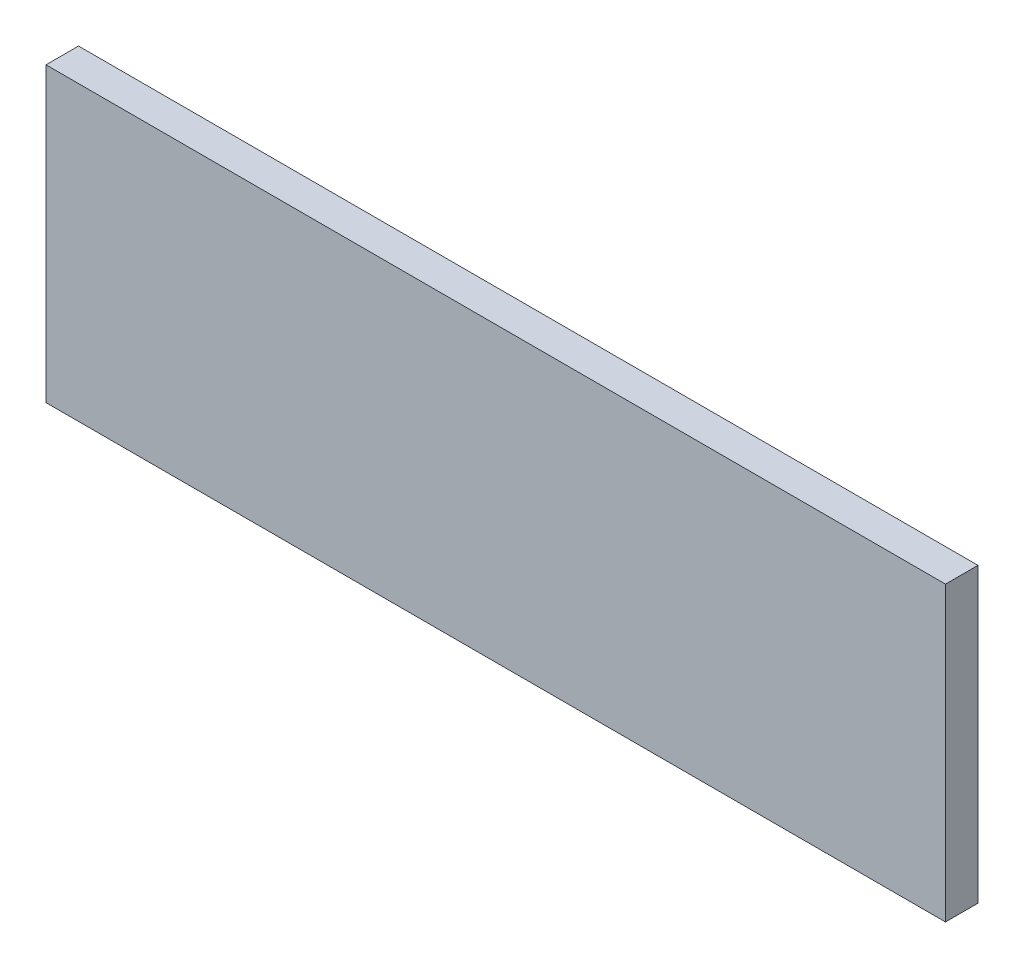
ISO-10303-21;
HEADER;
FILE_DESCRIPTION(('STEP AP214'),'2;1');
FILE_NAME('part.step','',(''),(''),'','','');
FILE_SCHEMA(('AUTOMOTIVE_DESIGN { 1 0 10303 214 1 1 1 1 }'));
ENDSEC;
DATA;
#1=APPLICATION_CONTEXT('core data for automotive mechanical design processes');
#2=APPLICATION_PROTOCOL_DEFINITION('international standard','automotive_design',2000,#1);
#3=PRODUCT_CONTEXT('',#1,'mechanical');
#4=PRODUCT('Part','Part','',(#3));
#5=PRODUCT_RELATED_PRODUCT_CATEGORY('part','',(#4));
#6=PRODUCT_DEFINITION_FORMATION('','',#4);
#7=PRODUCT_DEFINITION_CONTEXT('part definition',#1,'design');
#8=PRODUCT_DEFINITION('design','',#6,#7);
#9=PRODUCT_DEFINITION_SHAPE('','',#8);
#10=(LENGTH_UNIT() NAMED_UNIT(*) SI_UNIT(.MILLI.,.METRE.));
#11=(NAMED_UNIT(*) PLANE_ANGLE_UNIT() SI_UNIT($,.RADIAN.));
#12=(NAMED_UNIT(*) SI_UNIT($,.STERADIAN.) SOLID_ANGLE_UNIT());
#13=UNCERTAINTY_MEASURE_WITH_UNIT(LENGTH_MEASURE(1.E-05),#10,'distance_accuracy_value','');
#14=(GEOMETRIC_REPRESENTATION_CONTEXT(3) GLOBAL_UNCERTAINTY_ASSIGNED_CONTEXT((#13)) GLOBAL_UNIT_ASSIGNED_CONTEXT((#10,
#11,#12)) REPRESENTATION_CONTEXT('',''));
#15=CARTESIAN_POINT('',(0.,0.,0.));
#16=DIRECTION('',(0.,0.,1.));
#17=DIRECTION('',(1.,0.,0.));
#18=AXIS2_PLACEMENT_3D('',#15,#16,#17);
#19=CARTESIAN_POINT('',(0.,0.,1.5));
#20=DIRECTION('',(1.,0.,0.));
#21=DIRECTION('',(0.,0.,-1.));
#22=AXIS2_PLACEMENT_3D('',#19,#20,#21);
#23=PLANE('',#22);
#24=DIRECTION('',(0.,-1.,0.));
#25=VECTOR('',#24,1.);
#26=CARTESIAN_POINT('',(0.,0.,0.));
#27=LINE('',#26,#25);
#28=CARTESIAN_POINT('',(0.,13.5,0.));
#29=VERTEX_POINT('',#28);
#30=CARTESIAN_POINT('',(0.,0.,0.));
#31=VERTEX_POINT('',#30);
#32=EDGE_CURVE('E96',#29,#31,#27,.T.);
#33=ORIENTED_EDGE('',*,*,#32,.T.);
#34=DIRECTION('',(0.,0.,-1.));
#35=VECTOR('',#34,1.);
#36=CARTESIAN_POINT('',(0.,0.,1.5));
#37=LINE('',#36,#35);
#38=CARTESIAN_POINT('',(0.,0.,1.5));
#39=VERTEX_POINT('',#38);
#40=EDGE_CURVE('E11',#39,#31,#37,.T.);
#41=ORIENTED_EDGE('',*,*,#40,.F.);
#42=DIRECTION('',(0.,-1.,0.));
#43=VECTOR('',#42,1.);
#44=CARTESIAN_POINT('',(0.,0.,1.5));
#45=LINE('',#44,#43);
#46=CARTESIAN_POINT('',(0.,13.5,1.5));
#47=VERTEX_POINT('',#46);
#48=EDGE_CURVE('E84',#47,#39,#45,.T.);
#49=ORIENTED_EDGE('',*,*,#48,.F.);
#50=DIRECTION('',(0.,0.,-1.));
#51=VECTOR('',#50,1.);
#52=CARTESIAN_POINT('',(0.,13.5,1.5));
#53=LINE('',#52,#51);
#54=EDGE_CURVE('E92',#47,#29,#53,.T.);
#55=ORIENTED_EDGE('',*,*,#54,.T.);
#56=EDGE_LOOP('',(#33,#41,#49,#55));
#57=FACE_BOUND('',#56,.T.);
#58=ADVANCED_FACE('F33',(#57),#23,.F.);
#59=CARTESIAN_POINT('',(0.,0.,1.5));
#60=DIRECTION('',(0.,1.,0.));
#61=DIRECTION('',(0.,0.,1.));
#62=AXIS2_PLACEMENT_3D('',#59,#60,#61);
#63=PLANE('',#62);
#64=DIRECTION('',(1.,0.,0.));
#65=VECTOR('',#64,1.);
#66=CARTESIAN_POINT('',(0.,0.,0.));
#67=LINE('',#66,#65);
#68=CARTESIAN_POINT('',(41.5,0.,0.));
#69=VERTEX_POINT('',#68);
#70=EDGE_CURVE('E88',#31,#69,#67,.T.);
#71=ORIENTED_EDGE('',*,*,#70,.T.);
#72=DIRECTION('',(0.,0.,-1.));
#73=VECTOR('',#72,1.);
#74=CARTESIAN_POINT('',(41.5,0.,1.5));
#75=LINE('',#74,#73);
#76=CARTESIAN_POINT('',(41.5,0.,1.5));
#77=VERTEX_POINT('',#76);
#78=EDGE_CURVE('E41',#77,#69,#75,.T.);
#79=ORIENTED_EDGE('',*,*,#78,.F.);
#80=DIRECTION('',(1.,0.,0.));
#81=VECTOR('',#80,1.);
#82=CARTESIAN_POINT('',(0.,0.,1.5));
#83=LINE('',#82,#81);
#84=EDGE_CURVE('E79',#39,#77,#83,.T.);
#85=ORIENTED_EDGE('',*,*,#84,.F.);
#86=ORIENTED_EDGE('',*,*,#40,.T.);
#87=EDGE_LOOP('',(#71,#79,#85,#86));
#88=FACE_BOUND('',#87,.T.);
#89=ADVANCED_FACE('F87',(#88),#63,.F.);
#90=CARTESIAN_POINT('',(41.5,0.,1.5));
#91=DIRECTION('',(-1.,0.,0.));
#92=DIRECTION('',(0.,0.,1.));
#93=AXIS2_PLACEMENT_3D('',#90,#91,#92);
#94=PLANE('',#93);
#95=DIRECTION('',(0.,1.,0.));
#96=VECTOR('',#95,1.);
#97=CARTESIAN_POINT('',(41.5,0.,0.));
#98=LINE('',#97,#96);
#99=CARTESIAN_POINT('',(41.5,13.5,0.));
#100=VERTEX_POINT('',#99);
#101=EDGE_CURVE('E66',#69,#100,#98,.T.);
#102=ORIENTED_EDGE('',*,*,#101,.T.);
#103=DIRECTION('',(0.,0.,-1.));
#104=VECTOR('',#103,1.);
#105=CARTESIAN_POINT('',(41.5,13.5,1.5));
#106=LINE('',#105,#104);
#107=CARTESIAN_POINT('',(41.5,13.5,1.5));
#108=VERTEX_POINT('',#107);
#109=EDGE_CURVE('E89',#108,#100,#106,.T.);
#110=ORIENTED_EDGE('',*,*,#109,.F.);
#111=DIRECTION('',(0.,1.,0.));
#112=VECTOR('',#111,1.);
#113=CARTESIAN_POINT('',(41.5,0.,1.5));
#114=LINE('',#113,#112);
#115=EDGE_CURVE('E82',#77,#108,#114,.T.);
#116=ORIENTED_EDGE('',*,*,#115,.F.);
#117=ORIENTED_EDGE('',*,*,#78,.T.);
#118=EDGE_LOOP('',(#102,#110,#116,#117));
#119=FACE_BOUND('',#118,.T.);
#120=ADVANCED_FACE('F90',(#119),#94,.F.);
#121=CARTESIAN_POINT('',(0.,13.5,1.5));
#122=DIRECTION('',(0.,-1.,0.));
#123=DIRECTION('',(0.,0.,-1.));
#124=AXIS2_PLACEMENT_3D('',#121,#122,#123);
#125=PLANE('',#124);
#126=DIRECTION('',(-1.,0.,0.));
#127=VECTOR('',#126,1.);
#128=CARTESIAN_POINT('',(0.,13.5,0.));
#129=LINE('',#128,#127);
#130=EDGE_CURVE('E72',#100,#29,#129,.T.);
#131=ORIENTED_EDGE('',*,*,#130,.T.);
#132=ORIENTED_EDGE('',*,*,#54,.F.);
#133=DIRECTION('',(-1.,0.,0.));
#134=VECTOR('',#133,1.);
#135=CARTESIAN_POINT('',(0.,13.5,1.5));
#136=LINE('',#135,#134);
#137=EDGE_CURVE('E49',#108,#47,#136,.T.);
#138=ORIENTED_EDGE('',*,*,#137,.F.);
#139=ORIENTED_EDGE('',*,*,#109,.T.);
#140=EDGE_LOOP('',(#131,#132,#138,#139));
#141=FACE_BOUND('',#140,.T.);
#142=ADVANCED_FACE('F103',(#141),#125,.F.);
#143=CARTESIAN_POINT('',(0.,0.,1.5));
#144=DIRECTION('',(0.,0.,-1.));
#145=DIRECTION('',(-1.,0.,0.));
#146=AXIS2_PLACEMENT_3D('',#143,#144,#145);
#147=PLANE('',#146);
#148=ORIENTED_EDGE('',*,*,#48,.T.);
#149=ORIENTED_EDGE('',*,*,#84,.T.);
#150=ORIENTED_EDGE('',*,*,#115,.T.);
#151=ORIENTED_EDGE('',*,*,#137,.T.);
#152=EDGE_LOOP('',(#148,#149,#150,#151));
#153=FACE_BOUND('',#152,.T.);
#154=ADVANCED_FACE('F80',(#153),#147,.F.);
#155=CARTESIAN_POINT('',(0.,0.,0.));
#156=DIRECTION('',(0.,0.,-1.));
#157=DIRECTION('',(-1.,0.,0.));
#158=AXIS2_PLACEMENT_3D('',#155,#156,#157);
#159=PLANE('',#158);
#160=ORIENTED_EDGE('',*,*,#32,.F.);
#161=ORIENTED_EDGE('',*,*,#130,.F.);
#162=ORIENTED_EDGE('',*,*,#101,.F.);
#163=ORIENTED_EDGE('',*,*,#70,.F.);
#164=EDGE_LOOP('',(#160,#161,#162,#163));
#165=FACE_BOUND('',#164,.T.);
#166=ADVANCED_FACE('F106',(#165),#159,.T.);
#167=CLOSED_SHELL('',(#58,#89,#120,#142,#154,#166));
#168=MANIFOLD_SOLID_BREP('B2',#167);
#169=ADVANCED_BREP_SHAPE_REPRESENTATION('',(#18,#168),#14);
#170=SHAPE_DEFINITION_REPRESENTATION(#9,#169);
ENDSEC;
END-ISO-10303-21;
